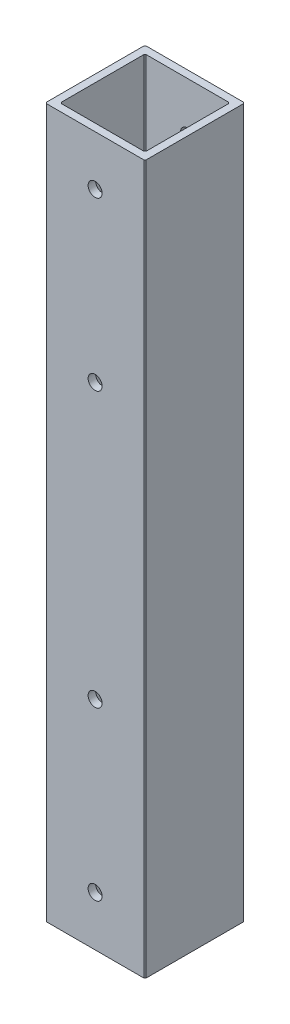
ISO-10303-21;
HEADER;
FILE_DESCRIPTION(('STEP AP214'),'2;1');
FILE_NAME('part.step','',(''),(''),'','','');
FILE_SCHEMA(('AUTOMOTIVE_DESIGN { 1 0 10303 214 1 1 1 1 }'));
ENDSEC;
DATA;
#1=APPLICATION_CONTEXT('core data for automotive mechanical design processes');
#2=APPLICATION_PROTOCOL_DEFINITION('international standard','automotive_design',2000,#1);
#3=PRODUCT_CONTEXT('',#1,'mechanical');
#4=PRODUCT('Part','Part','',(#3));
#5=PRODUCT_RELATED_PRODUCT_CATEGORY('part','',(#4));
#6=PRODUCT_DEFINITION_FORMATION('','',#4);
#7=PRODUCT_DEFINITION_CONTEXT('part definition',#1,'design');
#8=PRODUCT_DEFINITION('design','',#6,#7);
#9=PRODUCT_DEFINITION_SHAPE('','',#8);
#10=(LENGTH_UNIT() NAMED_UNIT(*) SI_UNIT(.MILLI.,.METRE.));
#11=(NAMED_UNIT(*) PLANE_ANGLE_UNIT() SI_UNIT($,.RADIAN.));
#12=(NAMED_UNIT(*) SI_UNIT($,.STERADIAN.) SOLID_ANGLE_UNIT());
#13=UNCERTAINTY_MEASURE_WITH_UNIT(LENGTH_MEASURE(1.E-05),#10,'distance_accuracy_value','');
#14=(GEOMETRIC_REPRESENTATION_CONTEXT(3) GLOBAL_UNCERTAINTY_ASSIGNED_CONTEXT((#13)) GLOBAL_UNIT_ASSIGNED_CONTEXT((#10,
#11,#12)) REPRESENTATION_CONTEXT('',''));
#15=CARTESIAN_POINT('',(0.,0.,0.));
#16=DIRECTION('',(0.,0.,1.));
#17=DIRECTION('',(1.,0.,0.));
#18=AXIS2_PLACEMENT_3D('',#15,#16,#17);
#19=CARTESIAN_POINT('',(210.,-142.,180.));
#20=DIRECTION('',(0.,0.,1.));
#21=DIRECTION('',(1.,0.,0.));
#22=AXIS2_PLACEMENT_3D('',#19,#20,#21);
#23=PLANE('',#22);
#24=CARTESIAN_POINT('',(190.,122.,180.));
#25=DIRECTION('',(0.,0.,-1.));
#26=DIRECTION('',(-1.,0.,0.));
#27=AXIS2_PLACEMENT_3D('',#24,#25,#26);
#28=CIRCLE('',#27,2.8);
#29=CARTESIAN_POINT('',(187.2,122.,180.));
#30=VERTEX_POINT('',#29);
#31=EDGE_CURVE('E530',#30,#30,#28,.T.);
#32=ORIENTED_EDGE('',*,*,#31,.T.);
#33=EDGE_LOOP('',(#32));
#34=FACE_BOUND('',#33,.T.);
#35=CARTESIAN_POINT('',(190.,55.,180.));
#36=DIRECTION('',(0.,0.,-1.));
#37=DIRECTION('',(-1.,0.,0.));
#38=AXIS2_PLACEMENT_3D('',#35,#36,#37);
#39=CIRCLE('',#38,2.8);
#40=CARTESIAN_POINT('',(187.2,55.,180.));
#41=VERTEX_POINT('',#40);
#42=EDGE_CURVE('E522',#41,#41,#39,.T.);
#43=ORIENTED_EDGE('',*,*,#42,.T.);
#44=EDGE_LOOP('',(#43));
#45=FACE_BOUND('',#44,.T.);
#46=CARTESIAN_POINT('',(190.,-55.,180.));
#47=DIRECTION('',(0.,0.,-1.));
#48=DIRECTION('',(-1.,0.,0.));
#49=AXIS2_PLACEMENT_3D('',#46,#47,#48);
#50=CIRCLE('',#49,2.8);
#51=CARTESIAN_POINT('',(187.2,-55.,180.));
#52=VERTEX_POINT('',#51);
#53=EDGE_CURVE('E514',#52,#52,#50,.T.);
#54=ORIENTED_EDGE('',*,*,#53,.T.);
#55=EDGE_LOOP('',(#54));
#56=FACE_BOUND('',#55,.T.);
#57=CARTESIAN_POINT('',(190.,-122.,180.));
#58=DIRECTION('',(0.,0.,-1.));
#59=DIRECTION('',(-1.,0.,0.));
#60=AXIS2_PLACEMENT_3D('',#57,#58,#59);
#61=CIRCLE('',#60,2.8);
#62=CARTESIAN_POINT('',(187.2,-122.,180.));
#63=VERTEX_POINT('',#62);
#64=EDGE_CURVE('E506',#63,#63,#61,.T.);
#65=ORIENTED_EDGE('',*,*,#64,.T.);
#66=EDGE_LOOP('',(#65));
#67=FACE_BOUND('',#66,.T.);
#68=DIRECTION('',(-1.,0.,0.));
#69=VECTOR('',#68,1.);
#70=CARTESIAN_POINT('',(210.,142.,180.));
#71=LINE('',#70,#69);
#72=CARTESIAN_POINT('',(209.5,142.,180.));
#73=VERTEX_POINT('',#72);
#74=CARTESIAN_POINT('',(170.5,142.,180.));
#75=VERTEX_POINT('',#74);
#76=EDGE_CURVE('E185',#73,#75,#71,.T.);
#77=ORIENTED_EDGE('',*,*,#76,.T.);
#78=DIRECTION('',(0.,-1.,0.));
#79=VECTOR('',#78,1.);
#80=CARTESIAN_POINT('',(170.5,-142.,180.));
#81=LINE('',#80,#79);
#82=CARTESIAN_POINT('',(170.5,-142.,180.));
#83=VERTEX_POINT('',#82);
#84=EDGE_CURVE('E229',#75,#83,#81,.T.);
#85=ORIENTED_EDGE('',*,*,#84,.T.);
#86=DIRECTION('',(-1.,0.,0.));
#87=VECTOR('',#86,1.);
#88=CARTESIAN_POINT('',(210.,-142.,180.));
#89=LINE('',#88,#87);
#90=CARTESIAN_POINT('',(209.5,-142.,180.));
#91=VERTEX_POINT('',#90);
#92=EDGE_CURVE('E196',#91,#83,#89,.T.);
#93=ORIENTED_EDGE('',*,*,#92,.F.);
#94=DIRECTION('',(0.,1.,0.));
#95=VECTOR('',#94,1.);
#96=CARTESIAN_POINT('',(209.5,142.,180.));
#97=LINE('',#96,#95);
#98=EDGE_CURVE('E226',#91,#73,#97,.T.);
#99=ORIENTED_EDGE('',*,*,#98,.T.);
#100=EDGE_LOOP('',(#77,#85,#93,#99));
#101=FACE_BOUND('',#100,.T.);
#102=ADVANCED_FACE('F45',(#34,#45,#56,#67,#101),#23,.T.);
#103=CARTESIAN_POINT('',(210.,-142.,140.));
#104=DIRECTION('',(0.,-1.,0.));
#105=DIRECTION('',(1.,0.,0.));
#106=AXIS2_PLACEMENT_3D('',#103,#104,#105);
#107=PLANE('',#106);
#108=DIRECTION('',(1.,0.,0.));
#109=VECTOR('',#108,1.);
#110=CARTESIAN_POINT('',(173.,-142.,143.));
#111=LINE('',#110,#109);
#112=CARTESIAN_POINT('',(173.5,-142.,143.));
#113=VERTEX_POINT('',#112);
#114=CARTESIAN_POINT('',(206.5,-142.,143.));
#115=VERTEX_POINT('',#114);
#116=EDGE_CURVE('E286',#113,#115,#111,.T.);
#117=ORIENTED_EDGE('',*,*,#116,.F.);
#118=DIRECTION('',(0.707106781186548,0.,-0.707106781186548));
#119=VECTOR('',#118,1.);
#120=CARTESIAN_POINT('',(173.5,-142.,143.));
#121=LINE('',#120,#119);
#122=CARTESIAN_POINT('',(173.,-142.,143.5));
#123=VERTEX_POINT('',#122);
#124=EDGE_CURVE('E55',#113,#123,#121,.F.);
#125=ORIENTED_EDGE('',*,*,#124,.T.);
#126=DIRECTION('',(0.,0.,-1.));
#127=VECTOR('',#126,1.);
#128=CARTESIAN_POINT('',(173.,-142.,177.));
#129=LINE('',#128,#127);
#130=CARTESIAN_POINT('',(173.,-142.,176.5));
#131=VERTEX_POINT('',#130);
#132=EDGE_CURVE('E284',#131,#123,#129,.T.);
#133=ORIENTED_EDGE('',*,*,#132,.F.);
#134=DIRECTION('',(-0.707106781186548,0.,-0.707106781186548));
#135=VECTOR('',#134,1.);
#136=CARTESIAN_POINT('',(173.,-142.,176.5));
#137=LINE('',#136,#135);
#138=CARTESIAN_POINT('',(173.5,-142.,177.));
#139=VERTEX_POINT('',#138);
#140=EDGE_CURVE('E260',#131,#139,#137,.F.);
#141=ORIENTED_EDGE('',*,*,#140,.T.);
#142=DIRECTION('',(-1.,0.,0.));
#143=VECTOR('',#142,1.);
#144=CARTESIAN_POINT('',(207.,-142.,177.));
#145=LINE('',#144,#143);
#146=CARTESIAN_POINT('',(206.5,-142.,177.));
#147=VERTEX_POINT('',#146);
#148=EDGE_CURVE('E297',#147,#139,#145,.T.);
#149=ORIENTED_EDGE('',*,*,#148,.F.);
#150=DIRECTION('',(-0.707106781186548,0.,0.707106781186548));
#151=VECTOR('',#150,1.);
#152=CARTESIAN_POINT('',(206.5,-142.,177.));
#153=LINE('',#152,#151);
#154=CARTESIAN_POINT('',(207.,-142.,176.5));
#155=VERTEX_POINT('',#154);
#156=EDGE_CURVE('E272',#147,#155,#153,.F.);
#157=ORIENTED_EDGE('',*,*,#156,.T.);
#158=DIRECTION('',(0.,0.,1.));
#159=VECTOR('',#158,1.);
#160=CARTESIAN_POINT('',(207.,-142.,143.));
#161=LINE('',#160,#159);
#162=CARTESIAN_POINT('',(207.,-142.,143.5));
#163=VERTEX_POINT('',#162);
#164=EDGE_CURVE('E327',#163,#155,#161,.T.);
#165=ORIENTED_EDGE('',*,*,#164,.F.);
#166=DIRECTION('',(0.707106781186548,0.,0.707106781186548));
#167=VECTOR('',#166,1.);
#168=CARTESIAN_POINT('',(207.,-142.,143.5));
#169=LINE('',#168,#167);
#170=EDGE_CURVE('E266',#163,#115,#169,.F.);
#171=ORIENTED_EDGE('',*,*,#170,.T.);
#172=EDGE_LOOP('',(#117,#125,#133,#141,#149,#157,#165,#171));
#173=FACE_BOUND('',#172,.T.);
#174=DIRECTION('',(-1.,0.,0.));
#175=VECTOR('',#174,1.);
#176=CARTESIAN_POINT('',(210.,-142.,140.));
#177=LINE('',#176,#175);
#178=CARTESIAN_POINT('',(209.5,-142.,140.));
#179=VERTEX_POINT('',#178);
#180=CARTESIAN_POINT('',(170.5,-142.,140.));
#181=VERTEX_POINT('',#180);
#182=EDGE_CURVE('E184',#179,#181,#177,.T.);
#183=ORIENTED_EDGE('',*,*,#182,.F.);
#184=DIRECTION('',(0.707106781186548,0.,0.707106781186548));
#185=VECTOR('',#184,1.);
#186=CARTESIAN_POINT('',(209.75,-142.,140.25));
#187=LINE('',#186,#185);
#188=CARTESIAN_POINT('',(210.,-142.,140.5));
#189=VERTEX_POINT('',#188);
#190=EDGE_CURVE('E188',#179,#189,#187,.T.);
#191=ORIENTED_EDGE('',*,*,#190,.T.);
#192=DIRECTION('',(0.,0.,1.));
#193=VECTOR('',#192,1.);
#194=CARTESIAN_POINT('',(210.,-142.,140.));
#195=LINE('',#194,#193);
#196=CARTESIAN_POINT('',(210.,-142.,179.5));
#197=VERTEX_POINT('',#196);
#198=EDGE_CURVE('E336',#189,#197,#195,.T.);
#199=ORIENTED_EDGE('',*,*,#198,.T.);
#200=DIRECTION('',(-0.707106781186548,0.,0.707106781186548));
#201=VECTOR('',#200,1.);
#202=CARTESIAN_POINT('',(229.75,-142.,159.75));
#203=LINE('',#202,#201);
#204=EDGE_CURVE('E190',#197,#91,#203,.T.);
#205=ORIENTED_EDGE('',*,*,#204,.T.);
#206=ORIENTED_EDGE('',*,*,#92,.T.);
#207=DIRECTION('',(0.707106781186548,0.,0.707106781186548));
#208=VECTOR('',#207,1.);
#209=CARTESIAN_POINT('',(170.25,-142.,179.75));
#210=LINE('',#209,#208);
#211=CARTESIAN_POINT('',(170.,-142.,179.5));
#212=VERTEX_POINT('',#211);
#213=EDGE_CURVE('E194',#83,#212,#210,.F.);
#214=ORIENTED_EDGE('',*,*,#213,.T.);
#215=DIRECTION('',(0.,0.,1.));
#216=VECTOR('',#215,1.);
#217=CARTESIAN_POINT('',(170.,-142.,140.));
#218=LINE('',#217,#216);
#219=CARTESIAN_POINT('',(170.,-142.,140.5));
#220=VERTEX_POINT('',#219);
#221=EDGE_CURVE('E337',#220,#212,#218,.T.);
#222=ORIENTED_EDGE('',*,*,#221,.F.);
#223=DIRECTION('',(-0.707106781186548,0.,0.707106781186548));
#224=VECTOR('',#223,1.);
#225=CARTESIAN_POINT('',(190.25,-142.,120.25));
#226=LINE('',#225,#224);
#227=EDGE_CURVE('E202',#220,#181,#226,.F.);
#228=ORIENTED_EDGE('',*,*,#227,.T.);
#229=EDGE_LOOP('',(#183,#191,#199,#205,#206,#214,#222,#228));
#230=FACE_BOUND('',#229,.T.);
#231=ADVANCED_FACE('F282',(#173,#230),#107,.T.);
#232=CARTESIAN_POINT('',(210.,142.,140.));
#233=DIRECTION('',(0.,0.,-1.));
#234=DIRECTION('',(-1.,0.,0.));
#235=AXIS2_PLACEMENT_3D('',#232,#233,#234);
#236=PLANE('',#235);
#237=CARTESIAN_POINT('',(190.,122.,140.));
#238=DIRECTION('',(0.,0.,-1.));
#239=DIRECTION('',(-1.,0.,0.));
#240=AXIS2_PLACEMENT_3D('',#237,#238,#239);
#241=CIRCLE('',#240,2.8);
#242=CARTESIAN_POINT('',(187.2,122.,140.));
#243=VERTEX_POINT('',#242);
#244=EDGE_CURVE('E471',#243,#243,#241,.T.);
#245=ORIENTED_EDGE('',*,*,#244,.F.);
#246=EDGE_LOOP('',(#245));
#247=FACE_BOUND('',#246,.T.);
#248=CARTESIAN_POINT('',(190.,55.,140.));
#249=DIRECTION('',(0.,0.,-1.));
#250=DIRECTION('',(-1.,0.,0.));
#251=AXIS2_PLACEMENT_3D('',#248,#249,#250);
#252=CIRCLE('',#251,2.8);
#253=CARTESIAN_POINT('',(187.2,55.,140.));
#254=VERTEX_POINT('',#253);
#255=EDGE_CURVE('E475',#254,#254,#252,.T.);
#256=ORIENTED_EDGE('',*,*,#255,.F.);
#257=EDGE_LOOP('',(#256));
#258=FACE_BOUND('',#257,.T.);
#259=CARTESIAN_POINT('',(190.,-55.,140.));
#260=DIRECTION('',(0.,0.,-1.));
#261=DIRECTION('',(-1.,0.,0.));
#262=AXIS2_PLACEMENT_3D('',#259,#260,#261);
#263=CIRCLE('',#262,2.8);
#264=CARTESIAN_POINT('',(187.2,-55.,140.));
#265=VERTEX_POINT('',#264);
#266=EDGE_CURVE('E479',#265,#265,#263,.T.);
#267=ORIENTED_EDGE('',*,*,#266,.F.);
#268=EDGE_LOOP('',(#267));
#269=FACE_BOUND('',#268,.T.);
#270=CARTESIAN_POINT('',(190.,-122.,140.));
#271=DIRECTION('',(0.,0.,-1.));
#272=DIRECTION('',(-1.,0.,0.));
#273=AXIS2_PLACEMENT_3D('',#270,#271,#272);
#274=CIRCLE('',#273,2.8);
#275=CARTESIAN_POINT('',(187.2,-122.,140.));
#276=VERTEX_POINT('',#275);
#277=EDGE_CURVE('E482',#276,#276,#274,.T.);
#278=ORIENTED_EDGE('',*,*,#277,.F.);
#279=EDGE_LOOP('',(#278));
#280=FACE_BOUND('',#279,.T.);
#281=DIRECTION('',(-1.,0.,0.));
#282=VECTOR('',#281,1.);
#283=CARTESIAN_POINT('',(210.,142.,140.));
#284=LINE('',#283,#282);
#285=CARTESIAN_POINT('',(209.5,142.,140.));
#286=VERTEX_POINT('',#285);
#287=CARTESIAN_POINT('',(170.5,142.,140.));
#288=VERTEX_POINT('',#287);
#289=EDGE_CURVE('E164',#286,#288,#284,.T.);
#290=ORIENTED_EDGE('',*,*,#289,.F.);
#291=DIRECTION('',(0.,-1.,0.));
#292=VECTOR('',#291,1.);
#293=CARTESIAN_POINT('',(209.5,-142.,140.));
#294=LINE('',#293,#292);
#295=EDGE_CURVE('E179',#286,#179,#294,.T.);
#296=ORIENTED_EDGE('',*,*,#295,.T.);
#297=ORIENTED_EDGE('',*,*,#182,.T.);
#298=DIRECTION('',(0.,1.,0.));
#299=VECTOR('',#298,1.);
#300=CARTESIAN_POINT('',(170.5,142.,140.));
#301=LINE('',#300,#299);
#302=EDGE_CURVE('E182',#181,#288,#301,.T.);
#303=ORIENTED_EDGE('',*,*,#302,.T.);
#304=EDGE_LOOP('',(#290,#296,#297,#303));
#305=FACE_BOUND('',#304,.T.);
#306=ADVANCED_FACE('F177',(#247,#258,#269,#280,#305),#236,.T.);
#307=CARTESIAN_POINT('',(210.,142.,180.));
#308=DIRECTION('',(0.,1.,0.));
#309=DIRECTION('',(-1.,0.,0.));
#310=AXIS2_PLACEMENT_3D('',#307,#308,#309);
#311=PLANE('',#310);
#312=DIRECTION('',(0.,0.,-1.));
#313=VECTOR('',#312,1.);
#314=CARTESIAN_POINT('',(173.,142.,177.));
#315=LINE('',#314,#313);
#316=CARTESIAN_POINT('',(173.,142.,176.5));
#317=VERTEX_POINT('',#316);
#318=CARTESIAN_POINT('',(173.,142.,143.5));
#319=VERTEX_POINT('',#318);
#320=EDGE_CURVE('E304',#317,#319,#315,.T.);
#321=ORIENTED_EDGE('',*,*,#320,.T.);
#322=DIRECTION('',(-0.707106781186548,0.,0.707106781186548));
#323=VECTOR('',#322,1.);
#324=CARTESIAN_POINT('',(173.5,142.,143.));
#325=LINE('',#324,#323);
#326=CARTESIAN_POINT('',(173.5,142.,143.));
#327=VERTEX_POINT('',#326);
#328=EDGE_CURVE('E11',#319,#327,#325,.F.);
#329=ORIENTED_EDGE('',*,*,#328,.T.);
#330=DIRECTION('',(1.,0.,0.));
#331=VECTOR('',#330,1.);
#332=CARTESIAN_POINT('',(173.,142.,143.));
#333=LINE('',#332,#331);
#334=CARTESIAN_POINT('',(206.5,142.,143.));
#335=VERTEX_POINT('',#334);
#336=EDGE_CURVE('E296',#327,#335,#333,.T.);
#337=ORIENTED_EDGE('',*,*,#336,.T.);
#338=DIRECTION('',(-0.707106781186548,0.,-0.707106781186548));
#339=VECTOR('',#338,1.);
#340=CARTESIAN_POINT('',(207.,142.,143.5));
#341=LINE('',#340,#339);
#342=CARTESIAN_POINT('',(207.,142.,143.5));
#343=VERTEX_POINT('',#342);
#344=EDGE_CURVE('E269',#335,#343,#341,.F.);
#345=ORIENTED_EDGE('',*,*,#344,.T.);
#346=DIRECTION('',(0.,0.,1.));
#347=VECTOR('',#346,1.);
#348=CARTESIAN_POINT('',(207.,142.,143.));
#349=LINE('',#348,#347);
#350=CARTESIAN_POINT('',(207.,142.,176.5));
#351=VERTEX_POINT('',#350);
#352=EDGE_CURVE('E309',#343,#351,#349,.T.);
#353=ORIENTED_EDGE('',*,*,#352,.T.);
#354=DIRECTION('',(0.707106781186548,0.,-0.707106781186548));
#355=VECTOR('',#354,1.);
#356=CARTESIAN_POINT('',(206.5,142.,177.));
#357=LINE('',#356,#355);
#358=CARTESIAN_POINT('',(206.5,142.,177.));
#359=VERTEX_POINT('',#358);
#360=EDGE_CURVE('E275',#351,#359,#357,.F.);
#361=ORIENTED_EDGE('',*,*,#360,.T.);
#362=DIRECTION('',(-1.,0.,0.));
#363=VECTOR('',#362,1.);
#364=CARTESIAN_POINT('',(207.,142.,177.));
#365=LINE('',#364,#363);
#366=CARTESIAN_POINT('',(173.5,142.,177.));
#367=VERTEX_POINT('',#366);
#368=EDGE_CURVE('E313',#359,#367,#365,.T.);
#369=ORIENTED_EDGE('',*,*,#368,.T.);
#370=DIRECTION('',(0.707106781186548,0.,0.707106781186548));
#371=VECTOR('',#370,1.);
#372=CARTESIAN_POINT('',(173.,142.,176.5));
#373=LINE('',#372,#371);
#374=EDGE_CURVE('E263',#367,#317,#373,.F.);
#375=ORIENTED_EDGE('',*,*,#374,.T.);
#376=EDGE_LOOP('',(#321,#329,#337,#345,#353,#361,#369,#375));
#377=FACE_BOUND('',#376,.T.);
#378=DIRECTION('',(0.,0.,-1.));
#379=VECTOR('',#378,1.);
#380=CARTESIAN_POINT('',(210.,142.,180.));
#381=LINE('',#380,#379);
#382=CARTESIAN_POINT('',(210.,142.,179.5));
#383=VERTEX_POINT('',#382);
#384=CARTESIAN_POINT('',(210.,142.,140.5));
#385=VERTEX_POINT('',#384);
#386=EDGE_CURVE('E167',#383,#385,#381,.T.);
#387=ORIENTED_EDGE('',*,*,#386,.T.);
#388=DIRECTION('',(-0.707106781186548,0.,-0.707106781186548));
#389=VECTOR('',#388,1.);
#390=CARTESIAN_POINT('',(229.75,142.,160.25));
#391=LINE('',#390,#389);
#392=EDGE_CURVE('E161',#385,#286,#391,.T.);
#393=ORIENTED_EDGE('',*,*,#392,.T.);
#394=ORIENTED_EDGE('',*,*,#289,.T.);
#395=DIRECTION('',(0.707106781186548,0.,-0.707106781186548));
#396=VECTOR('',#395,1.);
#397=CARTESIAN_POINT('',(170.25,142.,140.25));
#398=LINE('',#397,#396);
#399=CARTESIAN_POINT('',(170.,142.,140.5));
#400=VERTEX_POINT('',#399);
#401=EDGE_CURVE('E173',#288,#400,#398,.F.);
#402=ORIENTED_EDGE('',*,*,#401,.T.);
#403=DIRECTION('',(0.,0.,-1.));
#404=VECTOR('',#403,1.);
#405=CARTESIAN_POINT('',(170.,142.,180.));
#406=LINE('',#405,#404);
#407=CARTESIAN_POINT('',(170.,142.,179.5));
#408=VERTEX_POINT('',#407);
#409=EDGE_CURVE('E324',#408,#400,#406,.T.);
#410=ORIENTED_EDGE('',*,*,#409,.F.);
#411=DIRECTION('',(-0.707106781186548,0.,-0.707106781186548));
#412=VECTOR('',#411,1.);
#413=CARTESIAN_POINT('',(190.25,142.,199.75));
#414=LINE('',#413,#412);
#415=EDGE_CURVE('E62',#408,#75,#414,.F.);
#416=ORIENTED_EDGE('',*,*,#415,.T.);
#417=ORIENTED_EDGE('',*,*,#76,.F.);
#418=DIRECTION('',(0.707106781186548,0.,-0.707106781186548));
#419=VECTOR('',#418,1.);
#420=CARTESIAN_POINT('',(209.75,142.,179.75));
#421=LINE('',#420,#419);
#422=EDGE_CURVE('E70',#73,#383,#421,.T.);
#423=ORIENTED_EDGE('',*,*,#422,.T.);
#424=EDGE_LOOP('',(#387,#393,#394,#402,#410,#416,#417,#423));
#425=FACE_BOUND('',#424,.T.);
#426=ADVANCED_FACE('F163',(#377,#425),#311,.T.);
#427=CARTESIAN_POINT('',(210.,0.,0.));
#428=DIRECTION('',(-1.,0.,0.));
#429=DIRECTION('',(0.,-1.,0.));
#430=AXIS2_PLACEMENT_3D('',#427,#428,#429);
#431=PLANE('',#430);
#432=ORIENTED_EDGE('',*,*,#198,.F.);
#433=DIRECTION('',(0.,1.,0.));
#434=VECTOR('',#433,1.);
#435=CARTESIAN_POINT('',(210.,142.,140.5));
#436=LINE('',#435,#434);
#437=EDGE_CURVE('E210',#189,#385,#436,.T.);
#438=ORIENTED_EDGE('',*,*,#437,.T.);
#439=ORIENTED_EDGE('',*,*,#386,.F.);
#440=DIRECTION('',(0.,-1.,0.));
#441=VECTOR('',#440,1.);
#442=CARTESIAN_POINT('',(210.,-142.,179.5));
#443=LINE('',#442,#441);
#444=EDGE_CURVE('E207',#383,#197,#443,.T.);
#445=ORIENTED_EDGE('',*,*,#444,.T.);
#446=EDGE_LOOP('',(#432,#438,#439,#445));
#447=FACE_BOUND('',#446,.T.);
#448=ADVANCED_FACE('F368',(#447),#431,.F.);
#449=CARTESIAN_POINT('',(170.,0.,0.));
#450=DIRECTION('',(-1.,0.,0.));
#451=DIRECTION('',(0.,-1.,0.));
#452=AXIS2_PLACEMENT_3D('',#449,#450,#451);
#453=PLANE('',#452);
#454=ORIENTED_EDGE('',*,*,#409,.T.);
#455=DIRECTION('',(0.,-1.,0.));
#456=VECTOR('',#455,1.);
#457=CARTESIAN_POINT('',(170.,0.,140.5));
#458=LINE('',#457,#456);
#459=EDGE_CURVE('E222',#400,#220,#458,.T.);
#460=ORIENTED_EDGE('',*,*,#459,.T.);
#461=ORIENTED_EDGE('',*,*,#221,.T.);
#462=DIRECTION('',(0.,1.,0.));
#463=VECTOR('',#462,1.);
#464=CARTESIAN_POINT('',(170.,0.,179.5));
#465=LINE('',#464,#463);
#466=EDGE_CURVE('E172',#212,#408,#465,.T.);
#467=ORIENTED_EDGE('',*,*,#466,.T.);
#468=EDGE_LOOP('',(#454,#460,#461,#467));
#469=FACE_BOUND('',#468,.T.);
#470=ADVANCED_FACE('F361',(#469),#453,.T.);
#471=CARTESIAN_POINT('',(173.,142.,143.));
#472=DIRECTION('',(0.,0.,-1.));
#473=DIRECTION('',(-1.,0.,0.));
#474=AXIS2_PLACEMENT_3D('',#471,#472,#473);
#475=PLANE('',#474);
#476=CARTESIAN_POINT('',(190.,122.,143.));
#477=DIRECTION('',(0.,0.,-1.));
#478=DIRECTION('',(-1.,0.,0.));
#479=AXIS2_PLACEMENT_3D('',#476,#477,#478);
#480=CIRCLE('',#479,2.8);
#481=CARTESIAN_POINT('',(187.2,122.,143.));
#482=VERTEX_POINT('',#481);
#483=EDGE_CURVE('E500',#482,#482,#480,.T.);
#484=ORIENTED_EDGE('',*,*,#483,.T.);
#485=EDGE_LOOP('',(#484));
#486=FACE_BOUND('',#485,.T.);
#487=CARTESIAN_POINT('',(190.,55.,143.));
#488=DIRECTION('',(0.,0.,-1.));
#489=DIRECTION('',(-1.,0.,0.));
#490=AXIS2_PLACEMENT_3D('',#487,#488,#489);
#491=CIRCLE('',#490,2.8);
#492=CARTESIAN_POINT('',(187.2,55.,143.));
#493=VERTEX_POINT('',#492);
#494=EDGE_CURVE('E494',#493,#493,#491,.T.);
#495=ORIENTED_EDGE('',*,*,#494,.T.);
#496=EDGE_LOOP('',(#495));
#497=FACE_BOUND('',#496,.T.);
#498=CARTESIAN_POINT('',(190.,-55.,143.));
#499=DIRECTION('',(0.,0.,-1.));
#500=DIRECTION('',(-1.,0.,0.));
#501=AXIS2_PLACEMENT_3D('',#498,#499,#500);
#502=CIRCLE('',#501,2.8);
#503=CARTESIAN_POINT('',(187.2,-55.,143.));
#504=VERTEX_POINT('',#503);
#505=EDGE_CURVE('E485',#504,#504,#502,.T.);
#506=ORIENTED_EDGE('',*,*,#505,.T.);
#507=EDGE_LOOP('',(#506));
#508=FACE_BOUND('',#507,.T.);
#509=CARTESIAN_POINT('',(190.,-122.,143.));
#510=DIRECTION('',(0.,0.,-1.));
#511=DIRECTION('',(-1.,0.,0.));
#512=AXIS2_PLACEMENT_3D('',#509,#510,#511);
#513=CIRCLE('',#512,2.8);
#514=CARTESIAN_POINT('',(187.2,-122.,143.));
#515=VERTEX_POINT('',#514);
#516=EDGE_CURVE('E316',#515,#515,#513,.T.);
#517=ORIENTED_EDGE('',*,*,#516,.T.);
#518=EDGE_LOOP('',(#517));
#519=FACE_BOUND('',#518,.T.);
#520=ORIENTED_EDGE('',*,*,#116,.T.);
#521=DIRECTION('',(0.,1.,0.));
#522=VECTOR('',#521,1.);
#523=CARTESIAN_POINT('',(206.5,142.,143.));
#524=LINE('',#523,#522);
#525=EDGE_CURVE('E257',#115,#335,#524,.T.);
#526=ORIENTED_EDGE('',*,*,#525,.T.);
#527=ORIENTED_EDGE('',*,*,#336,.F.);
#528=DIRECTION('',(0.,-1.,0.));
#529=VECTOR('',#528,1.);
#530=CARTESIAN_POINT('',(173.5,-142.,143.));
#531=LINE('',#530,#529);
#532=EDGE_CURVE('E253',#327,#113,#531,.T.);
#533=ORIENTED_EDGE('',*,*,#532,.T.);
#534=EDGE_LOOP('',(#520,#526,#527,#533));
#535=FACE_BOUND('',#534,.T.);
#536=ADVANCED_FACE('F306',(#486,#497,#508,#519,#535),#475,.F.);
#537=CARTESIAN_POINT('',(173.,142.,177.));
#538=DIRECTION('',(-1.,0.,0.));
#539=DIRECTION('',(0.,-1.,0.));
#540=AXIS2_PLACEMENT_3D('',#537,#538,#539);
#541=PLANE('',#540);
#542=ORIENTED_EDGE('',*,*,#320,.F.);
#543=DIRECTION('',(0.,-1.,0.));
#544=VECTOR('',#543,1.);
#545=CARTESIAN_POINT('',(173.,-142.,176.5));
#546=LINE('',#545,#544);
#547=EDGE_CURVE('E235',#317,#131,#546,.T.);
#548=ORIENTED_EDGE('',*,*,#547,.T.);
#549=ORIENTED_EDGE('',*,*,#132,.T.);
#550=DIRECTION('',(0.,1.,0.));
#551=VECTOR('',#550,1.);
#552=CARTESIAN_POINT('',(173.,142.,143.5));
#553=LINE('',#552,#551);
#554=EDGE_CURVE('E232',#123,#319,#553,.T.);
#555=ORIENTED_EDGE('',*,*,#554,.T.);
#556=EDGE_LOOP('',(#542,#548,#549,#555));
#557=FACE_BOUND('',#556,.T.);
#558=ADVANCED_FACE('F292',(#557),#541,.F.);
#559=CARTESIAN_POINT('',(207.,142.,177.));
#560=DIRECTION('',(0.,0.,1.));
#561=DIRECTION('',(1.,0.,0.));
#562=AXIS2_PLACEMENT_3D('',#559,#560,#561);
#563=PLANE('',#562);
#564=CARTESIAN_POINT('',(190.,122.,177.));
#565=DIRECTION('',(0.,0.,-1.));
#566=DIRECTION('',(-1.,0.,0.));
#567=AXIS2_PLACEMENT_3D('',#564,#565,#566);
#568=CIRCLE('',#567,2.8);
#569=CARTESIAN_POINT('',(187.2,122.,177.));
#570=VERTEX_POINT('',#569);
#571=EDGE_CURVE('E533',#570,#570,#568,.T.);
#572=ORIENTED_EDGE('',*,*,#571,.F.);
#573=EDGE_LOOP('',(#572));
#574=FACE_BOUND('',#573,.T.);
#575=CARTESIAN_POINT('',(190.,55.,177.));
#576=DIRECTION('',(0.,0.,-1.));
#577=DIRECTION('',(-1.,0.,0.));
#578=AXIS2_PLACEMENT_3D('',#575,#576,#577);
#579=CIRCLE('',#578,2.8);
#580=CARTESIAN_POINT('',(187.2,55.,177.));
#581=VERTEX_POINT('',#580);
#582=EDGE_CURVE('E526',#581,#581,#579,.T.);
#583=ORIENTED_EDGE('',*,*,#582,.F.);
#584=EDGE_LOOP('',(#583));
#585=FACE_BOUND('',#584,.T.);
#586=CARTESIAN_POINT('',(190.,-55.,177.));
#587=DIRECTION('',(0.,0.,-1.));
#588=DIRECTION('',(-1.,0.,0.));
#589=AXIS2_PLACEMENT_3D('',#586,#587,#588);
#590=CIRCLE('',#589,2.8);
#591=CARTESIAN_POINT('',(187.2,-55.,177.));
#592=VERTEX_POINT('',#591);
#593=EDGE_CURVE('E518',#592,#592,#590,.T.);
#594=ORIENTED_EDGE('',*,*,#593,.F.);
#595=EDGE_LOOP('',(#594));
#596=FACE_BOUND('',#595,.T.);
#597=CARTESIAN_POINT('',(190.,-122.,177.));
#598=DIRECTION('',(0.,0.,-1.));
#599=DIRECTION('',(-1.,0.,0.));
#600=AXIS2_PLACEMENT_3D('',#597,#598,#599);
#601=CIRCLE('',#600,2.8);
#602=CARTESIAN_POINT('',(187.2,-122.,177.));
#603=VERTEX_POINT('',#602);
#604=EDGE_CURVE('E510',#603,#603,#601,.T.);
#605=ORIENTED_EDGE('',*,*,#604,.F.);
#606=EDGE_LOOP('',(#605));
#607=FACE_BOUND('',#606,.T.);
#608=ORIENTED_EDGE('',*,*,#148,.T.);
#609=DIRECTION('',(0.,1.,0.));
#610=VECTOR('',#609,1.);
#611=CARTESIAN_POINT('',(173.5,142.,177.));
#612=LINE('',#611,#610);
#613=EDGE_CURVE('E243',#139,#367,#612,.T.);
#614=ORIENTED_EDGE('',*,*,#613,.T.);
#615=ORIENTED_EDGE('',*,*,#368,.F.);
#616=DIRECTION('',(0.,-1.,0.));
#617=VECTOR('',#616,1.);
#618=CARTESIAN_POINT('',(206.5,-142.,177.));
#619=LINE('',#618,#617);
#620=EDGE_CURVE('E239',#359,#147,#619,.T.);
#621=ORIENTED_EDGE('',*,*,#620,.T.);
#622=EDGE_LOOP('',(#608,#614,#615,#621));
#623=FACE_BOUND('',#622,.T.);
#624=ADVANCED_FACE('F436',(#574,#585,#596,#607,#623),#563,.F.);
#625=CARTESIAN_POINT('',(207.,142.,143.));
#626=DIRECTION('',(1.,0.,0.));
#627=DIRECTION('',(0.,1.,0.));
#628=AXIS2_PLACEMENT_3D('',#625,#626,#627);
#629=PLANE('',#628);
#630=ORIENTED_EDGE('',*,*,#352,.F.);
#631=DIRECTION('',(0.,-1.,0.));
#632=VECTOR('',#631,1.);
#633=CARTESIAN_POINT('',(207.,-142.,143.5));
#634=LINE('',#633,#632);
#635=EDGE_CURVE('E249',#343,#163,#634,.T.);
#636=ORIENTED_EDGE('',*,*,#635,.T.);
#637=ORIENTED_EDGE('',*,*,#164,.T.);
#638=DIRECTION('',(0.,1.,0.));
#639=VECTOR('',#638,1.);
#640=CARTESIAN_POINT('',(207.,142.,176.5));
#641=LINE('',#640,#639);
#642=EDGE_CURVE('E246',#155,#351,#641,.T.);
#643=ORIENTED_EDGE('',*,*,#642,.T.);
#644=EDGE_LOOP('',(#630,#636,#637,#643));
#645=FACE_BOUND('',#644,.T.);
#646=ADVANCED_FACE('F441',(#645),#629,.F.);
#647=CARTESIAN_POINT('',(190.,-122.,140.));
#648=DIRECTION('',(0.,0.,-1.));
#649=DIRECTION('',(-1.,0.,0.));
#650=AXIS2_PLACEMENT_3D('',#647,#648,#649);
#651=CYLINDRICAL_SURFACE('',#650,2.8);
#652=ORIENTED_EDGE('',*,*,#516,.F.);
#653=EDGE_LOOP('',(#652));
#654=FACE_BOUND('',#653,.T.);
#655=ORIENTED_EDGE('',*,*,#277,.T.);
#656=EDGE_LOOP('',(#655));
#657=FACE_BOUND('',#656,.T.);
#658=ADVANCED_FACE('F444',(#654,#657),#651,.F.);
#659=CARTESIAN_POINT('',(190.,-55.,140.));
#660=DIRECTION('',(0.,0.,-1.));
#661=DIRECTION('',(-1.,0.,0.));
#662=AXIS2_PLACEMENT_3D('',#659,#660,#661);
#663=CYLINDRICAL_SURFACE('',#662,2.8);
#664=ORIENTED_EDGE('',*,*,#505,.F.);
#665=EDGE_LOOP('',(#664));
#666=FACE_BOUND('',#665,.T.);
#667=ORIENTED_EDGE('',*,*,#266,.T.);
#668=EDGE_LOOP('',(#667));
#669=FACE_BOUND('',#668,.T.);
#670=ADVANCED_FACE('F450',(#666,#669),#663,.F.);
#671=CARTESIAN_POINT('',(190.,55.,140.));
#672=DIRECTION('',(0.,0.,-1.));
#673=DIRECTION('',(-1.,0.,0.));
#674=AXIS2_PLACEMENT_3D('',#671,#672,#673);
#675=CYLINDRICAL_SURFACE('',#674,2.8);
#676=ORIENTED_EDGE('',*,*,#494,.F.);
#677=EDGE_LOOP('',(#676));
#678=FACE_BOUND('',#677,.T.);
#679=ORIENTED_EDGE('',*,*,#255,.T.);
#680=EDGE_LOOP('',(#679));
#681=FACE_BOUND('',#680,.T.);
#682=ADVANCED_FACE('F558',(#678,#681),#675,.F.);
#683=CARTESIAN_POINT('',(190.,122.,140.));
#684=DIRECTION('',(0.,0.,-1.));
#685=DIRECTION('',(-1.,0.,0.));
#686=AXIS2_PLACEMENT_3D('',#683,#684,#685);
#687=CYLINDRICAL_SURFACE('',#686,2.8);
#688=ORIENTED_EDGE('',*,*,#483,.F.);
#689=EDGE_LOOP('',(#688));
#690=FACE_BOUND('',#689,.T.);
#691=ORIENTED_EDGE('',*,*,#244,.T.);
#692=EDGE_LOOP('',(#691));
#693=FACE_BOUND('',#692,.T.);
#694=ADVANCED_FACE('F548',(#690,#693),#687,.F.);
#695=CARTESIAN_POINT('',(190.,-122.,177.));
#696=DIRECTION('',(0.,0.,-1.));
#697=DIRECTION('',(-1.,0.,0.));
#698=AXIS2_PLACEMENT_3D('',#695,#696,#697);
#699=CYLINDRICAL_SURFACE('',#698,2.8);
#700=ORIENTED_EDGE('',*,*,#64,.F.);
#701=EDGE_LOOP('',(#700));
#702=FACE_BOUND('',#701,.T.);
#703=ORIENTED_EDGE('',*,*,#604,.T.);
#704=EDGE_LOOP('',(#703));
#705=FACE_BOUND('',#704,.T.);
#706=ADVANCED_FACE('F545',(#702,#705),#699,.F.);
#707=CARTESIAN_POINT('',(190.,-55.,177.));
#708=DIRECTION('',(0.,0.,-1.));
#709=DIRECTION('',(-1.,0.,0.));
#710=AXIS2_PLACEMENT_3D('',#707,#708,#709);
#711=CYLINDRICAL_SURFACE('',#710,2.8);
#712=ORIENTED_EDGE('',*,*,#53,.F.);
#713=EDGE_LOOP('',(#712));
#714=FACE_BOUND('',#713,.T.);
#715=ORIENTED_EDGE('',*,*,#593,.T.);
#716=EDGE_LOOP('',(#715));
#717=FACE_BOUND('',#716,.T.);
#718=ADVANCED_FACE('F547',(#714,#717),#711,.F.);
#719=CARTESIAN_POINT('',(190.,55.,177.));
#720=DIRECTION('',(0.,0.,-1.));
#721=DIRECTION('',(-1.,0.,0.));
#722=AXIS2_PLACEMENT_3D('',#719,#720,#721);
#723=CYLINDRICAL_SURFACE('',#722,2.8);
#724=ORIENTED_EDGE('',*,*,#42,.F.);
#725=EDGE_LOOP('',(#724));
#726=FACE_BOUND('',#725,.T.);
#727=ORIENTED_EDGE('',*,*,#582,.T.);
#728=EDGE_LOOP('',(#727));
#729=FACE_BOUND('',#728,.T.);
#730=ADVANCED_FACE('F555',(#726,#729),#723,.F.);
#731=CARTESIAN_POINT('',(190.,122.,177.));
#732=DIRECTION('',(0.,0.,-1.));
#733=DIRECTION('',(-1.,0.,0.));
#734=AXIS2_PLACEMENT_3D('',#731,#732,#733);
#735=CYLINDRICAL_SURFACE('',#734,2.8);
#736=ORIENTED_EDGE('',*,*,#31,.F.);
#737=EDGE_LOOP('',(#736));
#738=FACE_BOUND('',#737,.T.);
#739=ORIENTED_EDGE('',*,*,#571,.T.);
#740=EDGE_LOOP('',(#739));
#741=FACE_BOUND('',#740,.T.);
#742=ADVANCED_FACE('F402',(#738,#741),#735,.F.);
#743=CARTESIAN_POINT('',(209.5,142.,140.));
#744=DIRECTION('',(0.707106781186547,0.,-0.707106781186547));
#745=DIRECTION('',(0.,1.,0.));
#746=AXIS2_PLACEMENT_3D('',#743,#744,#745);
#747=PLANE('',#746);
#748=ORIENTED_EDGE('',*,*,#392,.F.);
#749=ORIENTED_EDGE('',*,*,#437,.F.);
#750=ORIENTED_EDGE('',*,*,#190,.F.);
#751=ORIENTED_EDGE('',*,*,#295,.F.);
#752=EDGE_LOOP('',(#748,#749,#750,#751));
#753=FACE_BOUND('',#752,.T.);
#754=ADVANCED_FACE('F187',(#753),#747,.T.);
#755=CARTESIAN_POINT('',(170.,0.,140.5));
#756=DIRECTION('',(0.707106781186548,0.,0.707106781186548));
#757=DIRECTION('',(0.,-1.,0.));
#758=AXIS2_PLACEMENT_3D('',#755,#756,#757);
#759=PLANE('',#758);
#760=ORIENTED_EDGE('',*,*,#401,.F.);
#761=ORIENTED_EDGE('',*,*,#302,.F.);
#762=ORIENTED_EDGE('',*,*,#227,.F.);
#763=ORIENTED_EDGE('',*,*,#459,.F.);
#764=EDGE_LOOP('',(#760,#761,#762,#763));
#765=FACE_BOUND('',#764,.T.);
#766=ADVANCED_FACE('F364',(#765),#759,.F.);
#767=CARTESIAN_POINT('',(170.,0.,179.5));
#768=DIRECTION('',(0.707106781186547,0.,-0.707106781186547));
#769=DIRECTION('',(0.,1.,0.));
#770=AXIS2_PLACEMENT_3D('',#767,#768,#769);
#771=PLANE('',#770);
#772=ORIENTED_EDGE('',*,*,#213,.F.);
#773=ORIENTED_EDGE('',*,*,#84,.F.);
#774=ORIENTED_EDGE('',*,*,#415,.F.);
#775=ORIENTED_EDGE('',*,*,#466,.F.);
#776=EDGE_LOOP('',(#772,#773,#774,#775));
#777=FACE_BOUND('',#776,.T.);
#778=ADVANCED_FACE('F357',(#777),#771,.F.);
#779=CARTESIAN_POINT('',(173.,142.,176.5));
#780=DIRECTION('',(0.707106781186547,0.,-0.707106781186547));
#781=DIRECTION('',(0.,1.,0.));
#782=AXIS2_PLACEMENT_3D('',#779,#780,#781);
#783=PLANE('',#782);
#784=ORIENTED_EDGE('',*,*,#374,.F.);
#785=ORIENTED_EDGE('',*,*,#613,.F.);
#786=ORIENTED_EDGE('',*,*,#140,.F.);
#787=ORIENTED_EDGE('',*,*,#547,.F.);
#788=EDGE_LOOP('',(#784,#785,#786,#787));
#789=FACE_BOUND('',#788,.T.);
#790=ADVANCED_FACE('F372',(#789),#783,.T.);
#791=CARTESIAN_POINT('',(209.5,-142.,180.));
#792=DIRECTION('',(0.707106781186548,0.,0.707106781186548));
#793=DIRECTION('',(0.,-1.,0.));
#794=AXIS2_PLACEMENT_3D('',#791,#792,#793);
#795=PLANE('',#794);
#796=ORIENTED_EDGE('',*,*,#204,.F.);
#797=ORIENTED_EDGE('',*,*,#444,.F.);
#798=ORIENTED_EDGE('',*,*,#422,.F.);
#799=ORIENTED_EDGE('',*,*,#98,.F.);
#800=EDGE_LOOP('',(#796,#797,#798,#799));
#801=FACE_BOUND('',#800,.T.);
#802=ADVANCED_FACE('F369',(#801),#795,.T.);
#803=CARTESIAN_POINT('',(207.,142.,143.5));
#804=DIRECTION('',(-0.707106781186548,0.,0.707106781186548));
#805=DIRECTION('',(0.,1.,0.));
#806=AXIS2_PLACEMENT_3D('',#803,#804,#805);
#807=PLANE('',#806);
#808=ORIENTED_EDGE('',*,*,#344,.F.);
#809=ORIENTED_EDGE('',*,*,#525,.F.);
#810=ORIENTED_EDGE('',*,*,#170,.F.);
#811=ORIENTED_EDGE('',*,*,#635,.F.);
#812=EDGE_LOOP('',(#808,#809,#810,#811));
#813=FACE_BOUND('',#812,.T.);
#814=ADVANCED_FACE('F371',(#813),#807,.T.);
#815=CARTESIAN_POINT('',(206.5,142.,177.));
#816=DIRECTION('',(-0.707106781186548,0.,-0.707106781186548));
#817=DIRECTION('',(0.,1.,0.));
#818=AXIS2_PLACEMENT_3D('',#815,#816,#817);
#819=PLANE('',#818);
#820=ORIENTED_EDGE('',*,*,#360,.F.);
#821=ORIENTED_EDGE('',*,*,#642,.F.);
#822=ORIENTED_EDGE('',*,*,#156,.F.);
#823=ORIENTED_EDGE('',*,*,#620,.F.);
#824=EDGE_LOOP('',(#820,#821,#822,#823));
#825=FACE_BOUND('',#824,.T.);
#826=ADVANCED_FACE('F378',(#825),#819,.T.);
#827=CARTESIAN_POINT('',(173.5,142.,143.));
#828=DIRECTION('',(0.707106781186547,0.,0.707106781186547));
#829=DIRECTION('',(0.,1.,0.));
#830=AXIS2_PLACEMENT_3D('',#827,#828,#829);
#831=PLANE('',#830);
#832=ORIENTED_EDGE('',*,*,#328,.F.);
#833=ORIENTED_EDGE('',*,*,#554,.F.);
#834=ORIENTED_EDGE('',*,*,#124,.F.);
#835=ORIENTED_EDGE('',*,*,#532,.F.);
#836=EDGE_LOOP('',(#832,#833,#834,#835));
#837=FACE_BOUND('',#836,.T.);
#838=ADVANCED_FACE('F48',(#837),#831,.T.);
#839=CLOSED_SHELL('',(#102,#231,#306,#426,#448,#470,#536,#558,#624,#646,#658,#670,#682,#694,
#706,#718,#730,#742,#754,#766,#778,#790,#802,#814,#826,#838));
#840=MANIFOLD_SOLID_BREP('B2',#839);
#841=ADVANCED_BREP_SHAPE_REPRESENTATION('',(#18,#840),#14);
#842=SHAPE_DEFINITION_REPRESENTATION(#9,#841);
ENDSEC;
END-ISO-10303-21;
